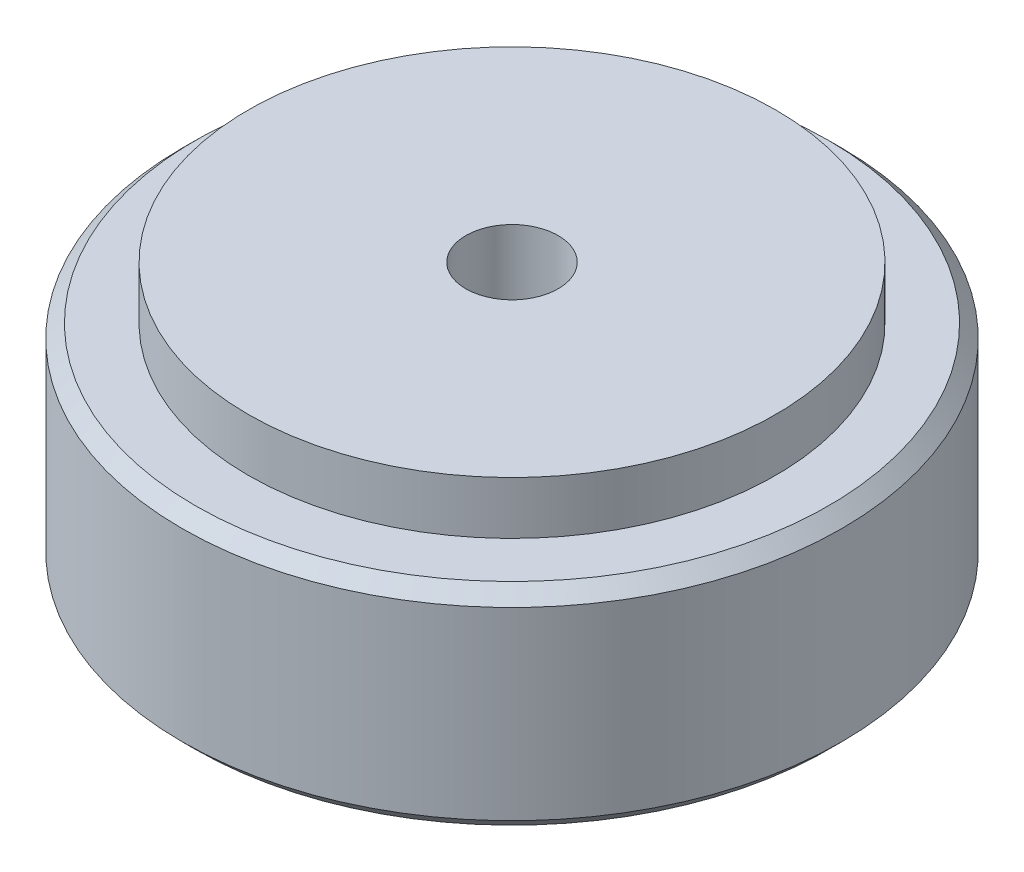
ISO-10303-21;
HEADER;
FILE_DESCRIPTION(('STEP AP214'),'2;1');
FILE_NAME('part.step','',(''),(''),'','','');
FILE_SCHEMA(('AUTOMOTIVE_DESIGN { 1 0 10303 214 1 1 1 1 }'));
ENDSEC;
DATA;
#1=APPLICATION_CONTEXT('core data for automotive mechanical design processes');
#2=APPLICATION_PROTOCOL_DEFINITION('international standard','automotive_design',2000,#1);
#3=PRODUCT_CONTEXT('',#1,'mechanical');
#4=PRODUCT('Part','Part','',(#3));
#5=PRODUCT_RELATED_PRODUCT_CATEGORY('part','',(#4));
#6=PRODUCT_DEFINITION_FORMATION('','',#4);
#7=PRODUCT_DEFINITION_CONTEXT('part definition',#1,'design');
#8=PRODUCT_DEFINITION('design','',#6,#7);
#9=PRODUCT_DEFINITION_SHAPE('','',#8);
#10=(LENGTH_UNIT() NAMED_UNIT(*) SI_UNIT(.MILLI.,.METRE.));
#11=(NAMED_UNIT(*) PLANE_ANGLE_UNIT() SI_UNIT($,.RADIAN.));
#12=(NAMED_UNIT(*) SI_UNIT($,.STERADIAN.) SOLID_ANGLE_UNIT());
#13=UNCERTAINTY_MEASURE_WITH_UNIT(LENGTH_MEASURE(1.E-05),#10,'distance_accuracy_value','');
#14=(GEOMETRIC_REPRESENTATION_CONTEXT(3) GLOBAL_UNCERTAINTY_ASSIGNED_CONTEXT((#13)) GLOBAL_UNIT_ASSIGNED_CONTEXT((#10,
#11,#12)) REPRESENTATION_CONTEXT('',''));
#15=CARTESIAN_POINT('',(0.,0.,0.));
#16=DIRECTION('',(0.,0.,1.));
#17=DIRECTION('',(1.,0.,0.));
#18=AXIS2_PLACEMENT_3D('',#15,#16,#17);
#19=CARTESIAN_POINT('',(0.,0.,0.));
#20=DIRECTION('',(0.,1.,0.));
#21=DIRECTION('',(0.,0.,1.));
#22=AXIS2_PLACEMENT_3D('',#19,#20,#21);
#23=PLANE('',#22);
#24=CARTESIAN_POINT('',(0.,0.,0.));
#25=DIRECTION('',(0.,-1.,0.));
#26=DIRECTION('',(0.,0.,-1.));
#27=AXIS2_PLACEMENT_3D('',#24,#25,#26);
#28=CIRCLE('',#27,3.);
#29=CARTESIAN_POINT('',(0.,0.,-3.));
#30=VERTEX_POINT('',#29);
#31=EDGE_CURVE('E76',#30,#30,#28,.T.);
#32=ORIENTED_EDGE('',*,*,#31,.F.);
#33=EDGE_LOOP('',(#32));
#34=FACE_BOUND('',#33,.T.);
#35=CARTESIAN_POINT('',(0.,0.,0.));
#36=DIRECTION('',(0.,-1.,0.));
#37=DIRECTION('',(0.,0.,-1.));
#38=AXIS2_PLACEMENT_3D('',#35,#36,#37);
#39=CIRCLE('',#38,8.);
#40=CARTESIAN_POINT('',(0.,0.,-8.));
#41=VERTEX_POINT('',#40);
#42=EDGE_CURVE('E85',#41,#41,#39,.T.);
#43=ORIENTED_EDGE('',*,*,#42,.T.);
#44=EDGE_LOOP('',(#43));
#45=FACE_BOUND('',#44,.T.);
#46=ADVANCED_FACE('F39',(#34,#45),#23,.F.);
#47=CARTESIAN_POINT('',(0.,-0.000999999999999265,0.));
#48=DIRECTION('',(0.,1.,0.));
#49=DIRECTION('',(0.,0.,1.));
#50=AXIS2_PLACEMENT_3D('',#47,#48,#49);
#51=CYLINDRICAL_SURFACE('',#50,1.75);
#52=CARTESIAN_POINT('',(0.,10.,0.));
#53=DIRECTION('',(0.,1.,0.));
#54=DIRECTION('',(0.,0.,1.));
#55=AXIS2_PLACEMENT_3D('',#52,#53,#54);
#56=CIRCLE('',#55,1.75);
#57=CARTESIAN_POINT('',(0.,10.,1.75));
#58=VERTEX_POINT('',#57);
#59=EDGE_CURVE('E67',#58,#58,#56,.T.);
#60=ORIENTED_EDGE('',*,*,#59,.T.);
#61=EDGE_LOOP('',(#60));
#62=FACE_BOUND('',#61,.T.);
#63=CARTESIAN_POINT('',(0.,5.,0.));
#64=DIRECTION('',(0.,-1.,0.));
#65=DIRECTION('',(0.,0.,-1.));
#66=AXIS2_PLACEMENT_3D('',#63,#64,#65);
#67=CIRCLE('',#66,1.75);
#68=CARTESIAN_POINT('',(0.,5.,-1.75));
#69=VERTEX_POINT('',#68);
#70=EDGE_CURVE('E64',#69,#69,#67,.F.);
#71=ORIENTED_EDGE('',*,*,#70,.F.);
#72=EDGE_LOOP('',(#71));
#73=FACE_BOUND('',#72,.T.);
#74=ADVANCED_FACE('F111',(#62,#73),#51,.F.);
#75=CARTESIAN_POINT('',(0.,8.,0.));
#76=DIRECTION('',(0.,-1.,0.));
#77=DIRECTION('',(0.,0.,-1.));
#78=AXIS2_PLACEMENT_3D('',#75,#76,#77);
#79=CYLINDRICAL_SURFACE('',#78,12.5);
#80=CARTESIAN_POINT('',(0.,0.499999999999997,0.));
#81=DIRECTION('',(0.,1.,0.));
#82=DIRECTION('',(0.,0.,1.));
#83=AXIS2_PLACEMENT_3D('',#80,#81,#82);
#84=CIRCLE('',#83,12.5);
#85=CARTESIAN_POINT('',(0.,0.499999999999997,12.5));
#86=VERTEX_POINT('',#85);
#87=EDGE_CURVE('E51',#86,#86,#84,.T.);
#88=ORIENTED_EDGE('',*,*,#87,.T.);
#89=EDGE_LOOP('',(#88));
#90=FACE_BOUND('',#89,.T.);
#91=CARTESIAN_POINT('',(0.,7.49999999999999,0.));
#92=DIRECTION('',(0.,1.,0.));
#93=DIRECTION('',(0.,0.,1.));
#94=AXIS2_PLACEMENT_3D('',#91,#92,#93);
#95=CIRCLE('',#94,12.5);
#96=CARTESIAN_POINT('',(0.,7.49999999999999,12.5));
#97=VERTEX_POINT('',#96);
#98=EDGE_CURVE('E55',#97,#97,#95,.F.);
#99=ORIENTED_EDGE('',*,*,#98,.T.);
#100=EDGE_LOOP('',(#99));
#101=FACE_BOUND('',#100,.T.);
#102=ADVANCED_FACE('F118',(#90,#101),#79,.T.);
#103=CARTESIAN_POINT('',(0.,8.,0.));
#104=DIRECTION('',(0.,1.,0.));
#105=DIRECTION('',(0.,0.,1.));
#106=AXIS2_PLACEMENT_3D('',#103,#104,#105);
#107=PLANE('',#106);
#108=CARTESIAN_POINT('',(0.,8.,0.));
#109=DIRECTION('',(0.,1.,0.));
#110=DIRECTION('',(0.,0.,1.));
#111=AXIS2_PLACEMENT_3D('',#108,#109,#110);
#112=CIRCLE('',#111,12.);
#113=CARTESIAN_POINT('',(0.,8.,12.));
#114=VERTEX_POINT('',#113);
#115=EDGE_CURVE('E10',#114,#114,#112,.T.);
#116=ORIENTED_EDGE('',*,*,#115,.T.);
#117=EDGE_LOOP('',(#116));
#118=FACE_BOUND('',#117,.T.);
#119=CARTESIAN_POINT('',(0.,8.,0.));
#120=DIRECTION('',(0.,1.,0.));
#121=DIRECTION('',(0.,0.,1.));
#122=AXIS2_PLACEMENT_3D('',#119,#120,#121);
#123=CIRCLE('',#122,10.);
#124=CARTESIAN_POINT('',(0.,8.,10.));
#125=VERTEX_POINT('',#124);
#126=EDGE_CURVE('E63',#125,#125,#123,.T.);
#127=ORIENTED_EDGE('',*,*,#126,.F.);
#128=EDGE_LOOP('',(#127));
#129=FACE_BOUND('',#128,.T.);
#130=ADVANCED_FACE('F127',(#118,#129),#107,.T.);
#131=CARTESIAN_POINT('',(0.,0.,0.));
#132=DIRECTION('',(0.,1.,0.));
#133=DIRECTION('',(0.,0.,1.));
#134=AXIS2_PLACEMENT_3D('',#131,#132,#133);
#135=CIRCLE('',#134,12.);
#136=CARTESIAN_POINT('',(0.,0.,12.));
#137=VERTEX_POINT('',#136);
#138=EDGE_CURVE('E47',#137,#137,#135,.F.);
#139=ORIENTED_EDGE('',*,*,#138,.T.);
#140=EDGE_LOOP('',(#139));
#141=FACE_BOUND('',#140,.T.);
#142=CARTESIAN_POINT('',(0.,0.,0.));
#143=DIRECTION('',(0.,1.,0.));
#144=DIRECTION('',(0.,0.,1.));
#145=AXIS2_PLACEMENT_3D('',#142,#143,#144);
#146=CIRCLE('',#145,9.);
#147=CARTESIAN_POINT('',(0.,0.,9.));
#148=VERTEX_POINT('',#147);
#149=EDGE_CURVE('E60',#148,#148,#146,.F.);
#150=ORIENTED_EDGE('',*,*,#149,.F.);
#151=EDGE_LOOP('',(#150));
#152=FACE_BOUND('',#151,.T.);
#153=ADVANCED_FACE('F114',(#141,#152),#23,.F.);
#154=CARTESIAN_POINT('',(0.,10.,0.));
#155=DIRECTION('',(0.,-1.,0.));
#156=DIRECTION('',(0.,0.,-1.));
#157=AXIS2_PLACEMENT_3D('',#154,#155,#156);
#158=CYLINDRICAL_SURFACE('',#157,10.);
#159=CARTESIAN_POINT('',(0.,10.,0.));
#160=DIRECTION('',(0.,1.,0.));
#161=DIRECTION('',(0.,0.,1.));
#162=AXIS2_PLACEMENT_3D('',#159,#160,#161);
#163=CIRCLE('',#162,10.);
#164=CARTESIAN_POINT('',(0.,10.,10.));
#165=VERTEX_POINT('',#164);
#166=EDGE_CURVE('E71',#165,#165,#163,.T.);
#167=ORIENTED_EDGE('',*,*,#166,.F.);
#168=EDGE_LOOP('',(#167));
#169=FACE_BOUND('',#168,.T.);
#170=ORIENTED_EDGE('',*,*,#126,.T.);
#171=EDGE_LOOP('',(#170));
#172=FACE_BOUND('',#171,.T.);
#173=ADVANCED_FACE('F126',(#169,#172),#158,.T.);
#174=CARTESIAN_POINT('',(0.,10.,0.));
#175=DIRECTION('',(0.,1.,0.));
#176=DIRECTION('',(0.,0.,1.));
#177=AXIS2_PLACEMENT_3D('',#174,#175,#176);
#178=PLANE('',#177);
#179=ORIENTED_EDGE('',*,*,#59,.F.);
#180=EDGE_LOOP('',(#179));
#181=FACE_BOUND('',#180,.T.);
#182=ORIENTED_EDGE('',*,*,#166,.T.);
#183=EDGE_LOOP('',(#182));
#184=FACE_BOUND('',#183,.T.);
#185=ADVANCED_FACE('F132',(#181,#184),#178,.T.);
#186=CARTESIAN_POINT('',(0.,5.,0.));
#187=DIRECTION('',(0.,-1.,0.));
#188=DIRECTION('',(0.,0.,-1.));
#189=AXIS2_PLACEMENT_3D('',#186,#187,#188);
#190=PLANE('',#189);
#191=CARTESIAN_POINT('',(0.,5.,0.));
#192=DIRECTION('',(0.,-1.,0.));
#193=DIRECTION('',(0.,0.,-1.));
#194=AXIS2_PLACEMENT_3D('',#191,#192,#193);
#195=CIRCLE('',#194,3.);
#196=CARTESIAN_POINT('',(0.,5.,-3.));
#197=VERTEX_POINT('',#196);
#198=EDGE_CURVE('E68',#197,#197,#195,.T.);
#199=ORIENTED_EDGE('',*,*,#198,.T.);
#200=EDGE_LOOP('',(#199));
#201=FACE_BOUND('',#200,.T.);
#202=ORIENTED_EDGE('',*,*,#70,.T.);
#203=EDGE_LOOP('',(#202));
#204=FACE_BOUND('',#203,.T.);
#205=ADVANCED_FACE('F106',(#201,#204),#190,.T.);
#206=CARTESIAN_POINT('',(0.,5.,0.));
#207=DIRECTION('',(0.,-1.,0.));
#208=DIRECTION('',(0.,0.,-1.));
#209=AXIS2_PLACEMENT_3D('',#206,#207,#208);
#210=CYLINDRICAL_SURFACE('',#209,3.);
#211=ORIENTED_EDGE('',*,*,#198,.F.);
#212=EDGE_LOOP('',(#211));
#213=FACE_BOUND('',#212,.T.);
#214=ORIENTED_EDGE('',*,*,#31,.T.);
#215=EDGE_LOOP('',(#214));
#216=FACE_BOUND('',#215,.T.);
#217=ADVANCED_FACE('F97',(#213,#216),#210,.F.);
#218=CARTESIAN_POINT('',(0.,-1.5,0.));
#219=DIRECTION('',(0.,-1.,0.));
#220=DIRECTION('',(0.,0.,-1.));
#221=AXIS2_PLACEMENT_3D('',#218,#219,#220);
#222=PLANE('',#221);
#223=CARTESIAN_POINT('',(0.,-1.5,0.));
#224=DIRECTION('',(0.,-1.,0.));
#225=DIRECTION('',(0.,0.,-1.));
#226=AXIS2_PLACEMENT_3D('',#223,#224,#225);
#227=CIRCLE('',#226,9.);
#228=CARTESIAN_POINT('',(0.,-1.5,-9.));
#229=VERTEX_POINT('',#228);
#230=EDGE_CURVE('E79',#229,#229,#227,.T.);
#231=ORIENTED_EDGE('',*,*,#230,.T.);
#232=EDGE_LOOP('',(#231));
#233=FACE_BOUND('',#232,.T.);
#234=CARTESIAN_POINT('',(0.,-1.5,0.));
#235=DIRECTION('',(0.,-1.,0.));
#236=DIRECTION('',(0.,0.,-1.));
#237=AXIS2_PLACEMENT_3D('',#234,#235,#236);
#238=CIRCLE('',#237,8.);
#239=CARTESIAN_POINT('',(0.,-1.5,-8.));
#240=VERTEX_POINT('',#239);
#241=EDGE_CURVE('E84',#240,#240,#238,.T.);
#242=ORIENTED_EDGE('',*,*,#241,.F.);
#243=EDGE_LOOP('',(#242));
#244=FACE_BOUND('',#243,.T.);
#245=ADVANCED_FACE('F94',(#233,#244),#222,.T.);
#246=CARTESIAN_POINT('',(0.,-1.5,0.));
#247=DIRECTION('',(0.,1.,0.));
#248=DIRECTION('',(0.,0.,1.));
#249=AXIS2_PLACEMENT_3D('',#246,#247,#248);
#250=CYLINDRICAL_SURFACE('',#249,9.);
#251=ORIENTED_EDGE('',*,*,#230,.F.);
#252=EDGE_LOOP('',(#251));
#253=FACE_BOUND('',#252,.T.);
#254=ORIENTED_EDGE('',*,*,#149,.T.);
#255=EDGE_LOOP('',(#254));
#256=FACE_BOUND('',#255,.T.);
#257=ADVANCED_FACE('F96',(#253,#256),#250,.T.);
#258=CARTESIAN_POINT('',(0.,-1.5,0.));
#259=DIRECTION('',(0.,1.,0.));
#260=DIRECTION('',(0.,0.,1.));
#261=AXIS2_PLACEMENT_3D('',#258,#259,#260);
#262=CYLINDRICAL_SURFACE('',#261,8.);
#263=ORIENTED_EDGE('',*,*,#241,.T.);
#264=EDGE_LOOP('',(#263));
#265=FACE_BOUND('',#264,.T.);
#266=ORIENTED_EDGE('',*,*,#42,.F.);
#267=EDGE_LOOP('',(#266));
#268=FACE_BOUND('',#267,.T.);
#269=ADVANCED_FACE('F91',(#265,#268),#262,.F.);
#270=CARTESIAN_POINT('',(0.,0.499999999999997,0.));
#271=DIRECTION('',(0.,1.,0.));
#272=DIRECTION('',(0.,0.,1.));
#273=AXIS2_PLACEMENT_3D('',#270,#271,#272);
#274=CONICAL_SURFACE('',#273,12.5,0.78539816339745);
#275=ORIENTED_EDGE('',*,*,#138,.F.);
#276=EDGE_LOOP('',(#275));
#277=FACE_BOUND('',#276,.T.);
#278=ORIENTED_EDGE('',*,*,#87,.F.);
#279=EDGE_LOOP('',(#278));
#280=FACE_BOUND('',#279,.T.);
#281=ADVANCED_FACE('F186',(#277,#280),#274,.T.);
#282=CARTESIAN_POINT('',(0.,8.,0.));
#283=DIRECTION('',(0.,-1.,0.));
#284=DIRECTION('',(0.,0.,-1.));
#285=AXIS2_PLACEMENT_3D('',#282,#283,#284);
#286=CONICAL_SURFACE('',#285,12.,0.785398163397443);
#287=ORIENTED_EDGE('',*,*,#98,.F.);
#288=EDGE_LOOP('',(#287));
#289=FACE_BOUND('',#288,.T.);
#290=ORIENTED_EDGE('',*,*,#115,.F.);
#291=EDGE_LOOP('',(#290));
#292=FACE_BOUND('',#291,.T.);
#293=ADVANCED_FACE('F42',(#289,#292),#286,.T.);
#294=CLOSED_SHELL('',(#46,#74,#102,#130,#153,#173,#185,#205,#217,#245,#257,#269,#281,#293));
#295=MANIFOLD_SOLID_BREP('B2',#294);
#296=ADVANCED_BREP_SHAPE_REPRESENTATION('',(#18,#295),#14);
#297=SHAPE_DEFINITION_REPRESENTATION(#9,#296);
ENDSEC;
END-ISO-10303-21;
